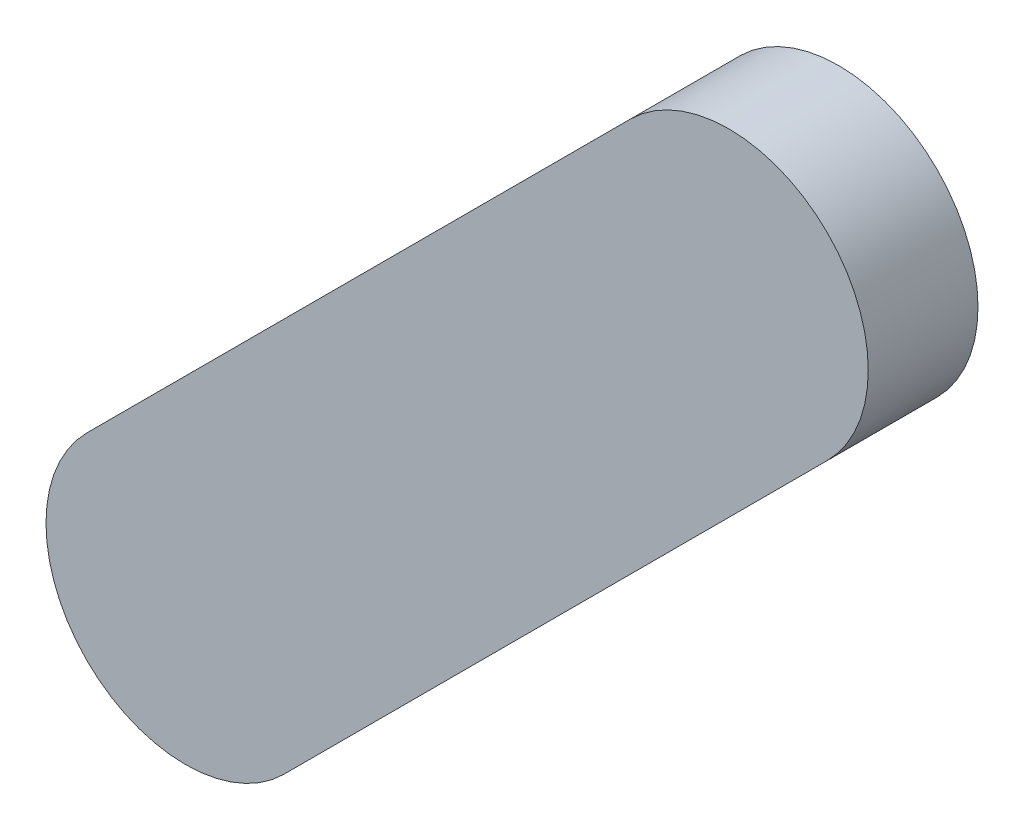
ISO-10303-21;
HEADER;
FILE_DESCRIPTION(('STEP AP214'),'2;1');
FILE_NAME('part.step','',(''),(''),'','','');
FILE_SCHEMA(('AUTOMOTIVE_DESIGN { 1 0 10303 214 1 1 1 1 }'));
ENDSEC;
DATA;
#1=APPLICATION_CONTEXT('core data for automotive mechanical design processes');
#2=APPLICATION_PROTOCOL_DEFINITION('international standard','automotive_design',2000,#1);
#3=PRODUCT_CONTEXT('',#1,'mechanical');
#4=PRODUCT('Part','Part','',(#3));
#5=PRODUCT_RELATED_PRODUCT_CATEGORY('part','',(#4));
#6=PRODUCT_DEFINITION_FORMATION('','',#4);
#7=PRODUCT_DEFINITION_CONTEXT('part definition',#1,'design');
#8=PRODUCT_DEFINITION('design','',#6,#7);
#9=PRODUCT_DEFINITION_SHAPE('','',#8);
#10=(LENGTH_UNIT() NAMED_UNIT(*) SI_UNIT(.MILLI.,.METRE.));
#11=(NAMED_UNIT(*) PLANE_ANGLE_UNIT() SI_UNIT($,.RADIAN.));
#12=(NAMED_UNIT(*) SI_UNIT($,.STERADIAN.) SOLID_ANGLE_UNIT());
#13=UNCERTAINTY_MEASURE_WITH_UNIT(LENGTH_MEASURE(1.E-05),#10,'distance_accuracy_value','');
#14=(GEOMETRIC_REPRESENTATION_CONTEXT(3) GLOBAL_UNCERTAINTY_ASSIGNED_CONTEXT((#13)) GLOBAL_UNIT_ASSIGNED_CONTEXT((#10,
#11,#12)) REPRESENTATION_CONTEXT('',''));
#15=CARTESIAN_POINT('',(0.,0.,0.));
#16=DIRECTION('',(0.,0.,1.));
#17=DIRECTION('',(1.,0.,0.));
#18=AXIS2_PLACEMENT_3D('',#15,#16,#17);
#19=CARTESIAN_POINT('',(102.0336034,113.61544206,0.));
#20=DIRECTION('',(-0.707106781186563,0.707106781186532,0.));
#21=DIRECTION('',(0.707106781186532,0.707106781186563,0.));
#22=AXIS2_PLACEMENT_3D('',#19,#20,#21);
#23=PLANE('',#22);
#24=DIRECTION('',(0.707106781186532,0.707106781186563,0.));
#25=VECTOR('',#24,1.);
#26=CARTESIAN_POINT('',(102.0336034,113.61544206,0.1999996));
#27=LINE('',#26,#25);
#28=CARTESIAN_POINT('',(102.0336034,113.61544206,0.1999996));
#29=VERTEX_POINT('',#28);
#30=CARTESIAN_POINT('',(103.02420594,114.6060446,0.1999996));
#31=VERTEX_POINT('',#30);
#32=EDGE_CURVE('E11',#29,#31,#27,.T.);
#33=ORIENTED_EDGE('',*,*,#32,.F.);
#34=DIRECTION('',(0.,0.,1.));
#35=VECTOR('',#34,1.);
#36=CARTESIAN_POINT('',(102.0336034,113.61544206,0.));
#37=LINE('',#36,#35);
#38=CARTESIAN_POINT('',(102.0336034,113.61544206,0.));
#39=VERTEX_POINT('',#38);
#40=EDGE_CURVE('E24',#39,#29,#37,.T.);
#41=ORIENTED_EDGE('',*,*,#40,.F.);
#42=DIRECTION('',(0.707106781186532,0.707106781186563,0.));
#43=VECTOR('',#42,1.);
#44=CARTESIAN_POINT('',(102.0336034,113.61544206,0.));
#45=LINE('',#44,#43);
#46=CARTESIAN_POINT('',(103.02420594,114.6060446,0.));
#47=VERTEX_POINT('',#46);
#48=EDGE_CURVE('E75',#39,#47,#45,.T.);
#49=ORIENTED_EDGE('',*,*,#48,.T.);
#50=DIRECTION('',(0.,0.,1.));
#51=VECTOR('',#50,1.);
#52=CARTESIAN_POINT('',(103.02420594,114.6060446,0.));
#53=LINE('',#52,#51);
#54=EDGE_CURVE('E37',#47,#31,#53,.T.);
#55=ORIENTED_EDGE('',*,*,#54,.T.);
#56=EDGE_LOOP('',(#33,#41,#49,#55));
#57=FACE_BOUND('',#56,.T.);
#58=ADVANCED_FACE('F17',(#57),#23,.F.);
#59=CARTESIAN_POINT('',(102.84460127,114.78564927,0.));
#60=DIRECTION('',(0.,0.,-1.));
#61=DIRECTION('',(0.707106781186548,-0.707106781186548,0.));
#62=AXIS2_PLACEMENT_3D('',#59,#60,#61);
#63=CYLINDRICAL_SURFACE('',#62,0.253999360179532);
#64=CARTESIAN_POINT('',(102.84460127,114.78564927,0.1999996));
#65=DIRECTION('',(0.,0.,1.));
#66=DIRECTION('',(0.707106781186548,-0.707106781186548,0.));
#67=AXIS2_PLACEMENT_3D('',#64,#65,#66);
#68=CIRCLE('',#67,0.253999360179532);
#69=CARTESIAN_POINT('',(102.6649966,114.96525394,0.1999996));
#70=VERTEX_POINT('',#69);
#71=EDGE_CURVE('E83',#31,#70,#68,.T.);
#72=ORIENTED_EDGE('',*,*,#71,.F.);
#73=ORIENTED_EDGE('',*,*,#54,.F.);
#74=CARTESIAN_POINT('',(102.84460127,114.78564927,0.));
#75=DIRECTION('',(0.,0.,1.));
#76=DIRECTION('',(0.707106781186548,-0.707106781186548,0.));
#77=AXIS2_PLACEMENT_3D('',#74,#75,#76);
#78=CIRCLE('',#77,0.253999360179532);
#79=CARTESIAN_POINT('',(102.6649966,114.96525394,0.));
#80=VERTEX_POINT('',#79);
#81=EDGE_CURVE('E81',#47,#80,#78,.T.);
#82=ORIENTED_EDGE('',*,*,#81,.T.);
#83=DIRECTION('',(0.,0.,1.));
#84=VECTOR('',#83,1.);
#85=CARTESIAN_POINT('',(102.6649966,114.96525394,0.));
#86=LINE('',#85,#84);
#87=EDGE_CURVE('E67',#80,#70,#86,.T.);
#88=ORIENTED_EDGE('',*,*,#87,.T.);
#89=EDGE_LOOP('',(#72,#73,#82,#88));
#90=FACE_BOUND('',#89,.T.);
#91=ADVANCED_FACE('F89',(#90),#63,.T.);
#92=CARTESIAN_POINT('',(102.6649966,114.96525394,0.));
#93=DIRECTION('',(0.707106781186542,-0.707106781186553,0.));
#94=DIRECTION('',(-0.707106781186553,-0.707106781186542,0.));
#95=AXIS2_PLACEMENT_3D('',#92,#93,#94);
#96=PLANE('',#95);
#97=DIRECTION('',(-0.707106781186553,-0.707106781186542,0.));
#98=VECTOR('',#97,1.);
#99=CARTESIAN_POINT('',(102.6649966,114.96525394,0.1999996));
#100=LINE('',#99,#98);
#101=CARTESIAN_POINT('',(101.67439406,113.9746514,0.1999996));
#102=VERTEX_POINT('',#101);
#103=EDGE_CURVE('E71',#70,#102,#100,.T.);
#104=ORIENTED_EDGE('',*,*,#103,.F.);
#105=ORIENTED_EDGE('',*,*,#87,.F.);
#106=DIRECTION('',(-0.707106781186553,-0.707106781186542,0.));
#107=VECTOR('',#106,1.);
#108=CARTESIAN_POINT('',(102.6649966,114.96525394,0.));
#109=LINE('',#108,#107);
#110=CARTESIAN_POINT('',(101.67439406,113.9746514,0.));
#111=VERTEX_POINT('',#110);
#112=EDGE_CURVE('E63',#80,#111,#109,.T.);
#113=ORIENTED_EDGE('',*,*,#112,.T.);
#114=DIRECTION('',(0.,0.,1.));
#115=VECTOR('',#114,1.);
#116=CARTESIAN_POINT('',(101.67439406,113.9746514,0.));
#117=LINE('',#116,#115);
#118=EDGE_CURVE('E53',#111,#102,#117,.T.);
#119=ORIENTED_EDGE('',*,*,#118,.T.);
#120=EDGE_LOOP('',(#104,#105,#113,#119));
#121=FACE_BOUND('',#120,.T.);
#122=ADVANCED_FACE('F66',(#121),#96,.F.);
#123=CARTESIAN_POINT('',(101.85399873,113.79504673,0.));
#124=DIRECTION('',(0.,0.,-1.));
#125=DIRECTION('',(-0.707106781186548,0.707106781186548,0.));
#126=AXIS2_PLACEMENT_3D('',#123,#124,#125);
#127=CYLINDRICAL_SURFACE('',#126,0.253999360179556);
#128=CARTESIAN_POINT('',(101.85399873,113.79504673,0.1999996));
#129=DIRECTION('',(0.,0.,1.));
#130=DIRECTION('',(-0.707106781186548,0.707106781186548,0.));
#131=AXIS2_PLACEMENT_3D('',#128,#129,#130);
#132=CIRCLE('',#131,0.253999360179556);
#133=EDGE_CURVE('E59',#102,#29,#132,.T.);
#134=ORIENTED_EDGE('',*,*,#133,.F.);
#135=ORIENTED_EDGE('',*,*,#118,.F.);
#136=CARTESIAN_POINT('',(101.85399873,113.79504673,0.));
#137=DIRECTION('',(0.,0.,1.));
#138=DIRECTION('',(-0.707106781186548,0.707106781186548,0.));
#139=AXIS2_PLACEMENT_3D('',#136,#137,#138);
#140=CIRCLE('',#139,0.253999360179556);
#141=EDGE_CURVE('E57',#111,#39,#140,.T.);
#142=ORIENTED_EDGE('',*,*,#141,.T.);
#143=ORIENTED_EDGE('',*,*,#40,.T.);
#144=EDGE_LOOP('',(#134,#135,#142,#143));
#145=FACE_BOUND('',#144,.T.);
#146=ADVANCED_FACE('F55',(#145),#127,.T.);
#147=CARTESIAN_POINT('',(102.0336034,113.61544206,0.));
#148=DIRECTION('',(0.,0.,-1.));
#149=DIRECTION('',(-1.,0.,0.));
#150=AXIS2_PLACEMENT_3D('',#147,#148,#149);
#151=PLANE('',#150);
#152=ORIENTED_EDGE('',*,*,#141,.F.);
#153=ORIENTED_EDGE('',*,*,#112,.F.);
#154=ORIENTED_EDGE('',*,*,#81,.F.);
#155=ORIENTED_EDGE('',*,*,#48,.F.);
#156=EDGE_LOOP('',(#152,#153,#154,#155));
#157=FACE_BOUND('',#156,.T.);
#158=ADVANCED_FACE('F74',(#157),#151,.T.);
#159=CARTESIAN_POINT('',(102.0336034,113.61544206,0.1999996));
#160=DIRECTION('',(0.,0.,-1.));
#161=DIRECTION('',(-1.,0.,0.));
#162=AXIS2_PLACEMENT_3D('',#159,#160,#161);
#163=PLANE('',#162);
#164=ORIENTED_EDGE('',*,*,#32,.T.);
#165=ORIENTED_EDGE('',*,*,#71,.T.);
#166=ORIENTED_EDGE('',*,*,#103,.T.);
#167=ORIENTED_EDGE('',*,*,#133,.T.);
#168=EDGE_LOOP('',(#164,#165,#166,#167));
#169=FACE_BOUND('',#168,.T.);
#170=ADVANCED_FACE('F91',(#169),#163,.F.);
#171=CLOSED_SHELL('',(#58,#91,#122,#146,#158,#170));
#172=MANIFOLD_SOLID_BREP('B1',#171);
#173=ADVANCED_BREP_SHAPE_REPRESENTATION('',(#18,#172),#14);
#174=SHAPE_DEFINITION_REPRESENTATION(#9,#173);
ENDSEC;
END-ISO-10303-21;
